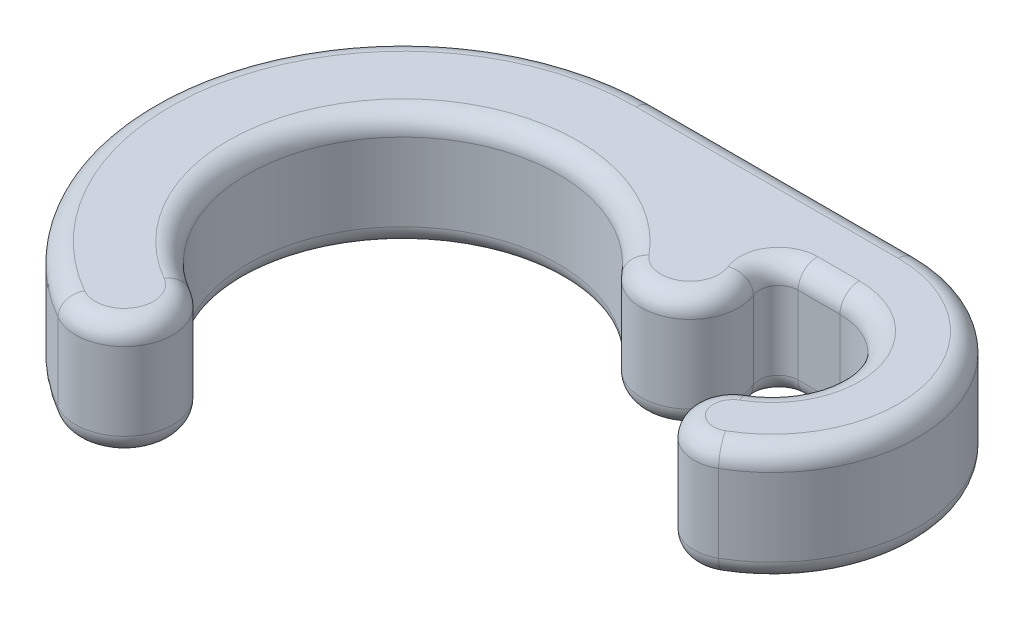
ISO-10303-21;
HEADER;
FILE_DESCRIPTION(('STEP AP214'),'2;1');
FILE_NAME('part.step','',(''),(''),'','','');
FILE_SCHEMA(('AUTOMOTIVE_DESIGN { 1 0 10303 214 1 1 1 1 }'));
ENDSEC;
DATA;
#1=APPLICATION_CONTEXT('core data for automotive mechanical design processes');
#2=APPLICATION_PROTOCOL_DEFINITION('international standard','automotive_design',2000,#1);
#3=PRODUCT_CONTEXT('',#1,'mechanical');
#4=PRODUCT('Part','Part','',(#3));
#5=PRODUCT_RELATED_PRODUCT_CATEGORY('part','',(#4));
#6=PRODUCT_DEFINITION_FORMATION('','',#4);
#7=PRODUCT_DEFINITION_CONTEXT('part definition',#1,'design');
#8=PRODUCT_DEFINITION('design','',#6,#7);
#9=PRODUCT_DEFINITION_SHAPE('','',#8);
#10=(LENGTH_UNIT() NAMED_UNIT(*) SI_UNIT(.MILLI.,.METRE.));
#11=(NAMED_UNIT(*) PLANE_ANGLE_UNIT() SI_UNIT($,.RADIAN.));
#12=(NAMED_UNIT(*) SI_UNIT($,.STERADIAN.) SOLID_ANGLE_UNIT());
#13=UNCERTAINTY_MEASURE_WITH_UNIT(LENGTH_MEASURE(1.E-05),#10,'distance_accuracy_value','');
#14=(GEOMETRIC_REPRESENTATION_CONTEXT(3) GLOBAL_UNCERTAINTY_ASSIGNED_CONTEXT((#13)) GLOBAL_UNIT_ASSIGNED_CONTEXT((#10,
#11,#12)) REPRESENTATION_CONTEXT('',''));
#15=CARTESIAN_POINT('',(0.,0.,0.));
#16=DIRECTION('',(0.,0.,1.));
#17=DIRECTION('',(1.,0.,0.));
#18=AXIS2_PLACEMENT_3D('',#15,#16,#17);
#19=CARTESIAN_POINT('',(4.05056924853039,3.,-3.33996837752395));
#20=DIRECTION('',(0.,-1.,0.));
#21=DIRECTION('',(0.,0.,-1.));
#22=AXIS2_PLACEMENT_3D('',#19,#20,#21);
#23=CYLINDRICAL_SURFACE('',#22,1.25);
#24=DIRECTION('',(0.,-1.,0.));
#25=VECTOR('',#24,1.);
#26=CARTESIAN_POINT('',(3.0861479988803,3.,-2.54473781144682));
#27=LINE('',#26,#25);
#28=CARTESIAN_POINT('',(3.0861479988803,2.5,-2.54473781144682));
#29=VERTEX_POINT('',#28);
#30=CARTESIAN_POINT('',(3.0861479988803,0.5,-2.54473781144682));
#31=VERTEX_POINT('',#30);
#32=EDGE_CURVE('E283',#29,#31,#27,.T.);
#33=ORIENTED_EDGE('',*,*,#32,.T.);
#34=CARTESIAN_POINT('',(4.05056924853039,0.5,-3.33996837752395));
#35=DIRECTION('',(0.,1.,0.));
#36=DIRECTION('',(0.,0.,1.));
#37=AXIS2_PLACEMENT_3D('',#34,#35,#36);
#38=CIRCLE('',#37,1.25);
#39=CARTESIAN_POINT('',(5.20825392268006,0.5,-3.81141953643541));
#40=VERTEX_POINT('',#39);
#41=EDGE_CURVE('E242',#31,#40,#38,.T.);
#42=ORIENTED_EDGE('',*,*,#41,.T.);
#43=DIRECTION('',(0.,-1.,0.));
#44=VECTOR('',#43,1.);
#45=CARTESIAN_POINT('',(5.20825392268006,3.,-3.81141953643541));
#46=LINE('',#45,#44);
#47=CARTESIAN_POINT('',(5.20825392268006,2.5,-3.81141953643541));
#48=VERTEX_POINT('',#47);
#49=EDGE_CURVE('E193',#40,#48,#46,.F.);
#50=ORIENTED_EDGE('',*,*,#49,.T.);
#51=CARTESIAN_POINT('',(4.05056924853039,2.5,-3.33996837752395));
#52=DIRECTION('',(0.,1.,0.));
#53=DIRECTION('',(0.,0.,1.));
#54=AXIS2_PLACEMENT_3D('',#51,#52,#53);
#55=CIRCLE('',#54,1.25);
#56=EDGE_CURVE('E240',#48,#29,#55,.F.);
#57=ORIENTED_EDGE('',*,*,#56,.T.);
#58=EDGE_LOOP('',(#33,#42,#50,#57));
#59=FACE_BOUND('',#58,.T.);
#60=ADVANCED_FACE('F36',(#59),#23,.T.);
#61=CARTESIAN_POINT('',(6.75,3.,-4.5));
#62=DIRECTION('',(0.,0.,-1.));
#63=DIRECTION('',(-1.,0.,0.));
#64=AXIS2_PLACEMENT_3D('',#61,#62,#63);
#65=PLANE('',#64);
#66=DIRECTION('',(0.,1.,0.));
#67=VECTOR('',#66,1.);
#68=CARTESIAN_POINT('',(5.67132779233993,0.,-4.5));
#69=LINE('',#68,#67);
#70=CARTESIAN_POINT('',(5.67132779233993,2.5,-4.5));
#71=VERTEX_POINT('',#70);
#72=CARTESIAN_POINT('',(5.67132779233993,0.5,-4.5));
#73=VERTEX_POINT('',#72);
#74=EDGE_CURVE('E337',#71,#73,#69,.F.);
#75=ORIENTED_EDGE('',*,*,#74,.T.);
#76=DIRECTION('',(1.,0.,0.));
#77=VECTOR('',#76,1.);
#78=CARTESIAN_POINT('',(6.75,0.5,-4.5));
#79=LINE('',#78,#77);
#80=CARTESIAN_POINT('',(6.75,0.5,-4.5));
#81=VERTEX_POINT('',#80);
#82=EDGE_CURVE('E209',#73,#81,#79,.T.);
#83=ORIENTED_EDGE('',*,*,#82,.T.);
#84=DIRECTION('',(0.,-1.,0.));
#85=VECTOR('',#84,1.);
#86=CARTESIAN_POINT('',(6.75,3.,-4.5));
#87=LINE('',#86,#85);
#88=CARTESIAN_POINT('',(6.75,2.5,-4.5));
#89=VERTEX_POINT('',#88);
#90=EDGE_CURVE('E335',#89,#81,#87,.T.);
#91=ORIENTED_EDGE('',*,*,#90,.F.);
#92=DIRECTION('',(1.,0.,0.));
#93=VECTOR('',#92,1.);
#94=CARTESIAN_POINT('',(5.67132779233993,2.5,-4.5));
#95=LINE('',#94,#93);
#96=EDGE_CURVE('E207',#89,#71,#95,.F.);
#97=ORIENTED_EDGE('',*,*,#96,.T.);
#98=EDGE_LOOP('',(#75,#83,#91,#97));
#99=FACE_BOUND('',#98,.T.);
#100=ADVANCED_FACE('F372',(#99),#65,.F.);
#101=CARTESIAN_POINT('',(6.75,3.,-2.75));
#102=DIRECTION('',(0.,-1.,0.));
#103=DIRECTION('',(0.,0.,-1.));
#104=AXIS2_PLACEMENT_3D('',#101,#102,#103);
#105=CYLINDRICAL_SURFACE('',#104,1.75);
#106=ORIENTED_EDGE('',*,*,#90,.T.);
#107=CARTESIAN_POINT('',(6.75,0.5,-2.75));
#108=DIRECTION('',(0.,1.,0.));
#109=DIRECTION('',(0.,0.,1.));
#110=AXIS2_PLACEMENT_3D('',#107,#108,#109);
#111=CIRCLE('',#110,1.75);
#112=CARTESIAN_POINT('',(7.625,0.5,-1.23445554337723));
#113=VERTEX_POINT('',#112);
#114=EDGE_CURVE('E213',#81,#113,#111,.F.);
#115=ORIENTED_EDGE('',*,*,#114,.T.);
#116=DIRECTION('',(0.,-1.,0.));
#117=VECTOR('',#116,1.);
#118=CARTESIAN_POINT('',(7.625,3.,-1.23445554337723));
#119=LINE('',#118,#117);
#120=CARTESIAN_POINT('',(7.625,2.5,-1.23445554337723));
#121=VERTEX_POINT('',#120);
#122=EDGE_CURVE('E326',#121,#113,#119,.T.);
#123=ORIENTED_EDGE('',*,*,#122,.F.);
#124=CARTESIAN_POINT('',(6.75,2.5,-2.75));
#125=DIRECTION('',(0.,1.,0.));
#126=DIRECTION('',(0.,0.,1.));
#127=AXIS2_PLACEMENT_3D('',#124,#125,#126);
#128=CIRCLE('',#127,1.75);
#129=EDGE_CURVE('E211',#121,#89,#128,.T.);
#130=ORIENTED_EDGE('',*,*,#129,.T.);
#131=EDGE_LOOP('',(#106,#115,#123,#130));
#132=FACE_BOUND('',#131,.T.);
#133=ADVANCED_FACE('F332',(#132),#105,.F.);
#134=CARTESIAN_POINT('',(8.12499999999999,3.,-0.368430139592791));
#135=DIRECTION('',(0.,-1.,0.));
#136=DIRECTION('',(0.,0.,-1.));
#137=AXIS2_PLACEMENT_3D('',#134,#135,#136);
#138=CYLINDRICAL_SURFACE('',#137,1.);
#139=ORIENTED_EDGE('',*,*,#122,.T.);
#140=CARTESIAN_POINT('',(8.12499999999999,0.5,-0.368430139592791));
#141=DIRECTION('',(0.,1.,0.));
#142=DIRECTION('',(0.,0.,1.));
#143=AXIS2_PLACEMENT_3D('',#140,#141,#142);
#144=CIRCLE('',#143,1.);
#145=CARTESIAN_POINT('',(8.62499999999999,0.5,0.497595264191649));
#146=VERTEX_POINT('',#145);
#147=EDGE_CURVE('E217',#113,#146,#144,.T.);
#148=ORIENTED_EDGE('',*,*,#147,.T.);
#149=DIRECTION('',(0.,-1.,0.));
#150=VECTOR('',#149,1.);
#151=CARTESIAN_POINT('',(8.62499999999999,3.,0.497595264191649));
#152=LINE('',#151,#150);
#153=CARTESIAN_POINT('',(8.62499999999999,2.5,0.497595264191649));
#154=VERTEX_POINT('',#153);
#155=EDGE_CURVE('E329',#154,#146,#152,.T.);
#156=ORIENTED_EDGE('',*,*,#155,.F.);
#157=CARTESIAN_POINT('',(8.12499999999999,2.5,-0.368430139592791));
#158=DIRECTION('',(0.,1.,0.));
#159=DIRECTION('',(0.,0.,1.));
#160=AXIS2_PLACEMENT_3D('',#157,#158,#159);
#161=CIRCLE('',#160,1.);
#162=EDGE_CURVE('E215',#154,#121,#161,.F.);
#163=ORIENTED_EDGE('',*,*,#162,.T.);
#164=EDGE_LOOP('',(#139,#148,#156,#163));
#165=FACE_BOUND('',#164,.T.);
#166=ADVANCED_FACE('F325',(#165),#138,.T.);
#167=CARTESIAN_POINT('',(6.75,3.,-2.75));
#168=DIRECTION('',(0.,-1.,0.));
#169=DIRECTION('',(0.,0.,-1.));
#170=AXIS2_PLACEMENT_3D('',#167,#168,#169);
#171=CYLINDRICAL_SURFACE('',#170,3.75);
#172=ORIENTED_EDGE('',*,*,#155,.T.);
#173=CARTESIAN_POINT('',(6.75,0.5,-2.75));
#174=DIRECTION('',(0.,1.,0.));
#175=DIRECTION('',(0.,0.,1.));
#176=AXIS2_PLACEMENT_3D('',#173,#174,#175);
#177=CIRCLE('',#176,3.75);
#178=CARTESIAN_POINT('',(6.75,0.5,-6.5));
#179=VERTEX_POINT('',#178);
#180=EDGE_CURVE('E221',#146,#179,#177,.T.);
#181=ORIENTED_EDGE('',*,*,#180,.T.);
#182=DIRECTION('',(0.,-1.,0.));
#183=VECTOR('',#182,1.);
#184=CARTESIAN_POINT('',(6.75,3.,-6.5));
#185=LINE('',#184,#183);
#186=CARTESIAN_POINT('',(6.75,2.5,-6.5));
#187=VERTEX_POINT('',#186);
#188=EDGE_CURVE('E339',#187,#179,#185,.T.);
#189=ORIENTED_EDGE('',*,*,#188,.F.);
#190=CARTESIAN_POINT('',(6.75,2.5,-2.75));
#191=DIRECTION('',(0.,1.,0.));
#192=DIRECTION('',(0.,0.,1.));
#193=AXIS2_PLACEMENT_3D('',#190,#191,#192);
#194=CIRCLE('',#193,3.75);
#195=EDGE_CURVE('E219',#187,#154,#194,.F.);
#196=ORIENTED_EDGE('',*,*,#195,.T.);
#197=EDGE_LOOP('',(#172,#181,#189,#196));
#198=FACE_BOUND('',#197,.T.);
#199=ADVANCED_FACE('F418',(#198),#171,.T.);
#200=CARTESIAN_POINT('',(6.75,3.,-6.5));
#201=DIRECTION('',(0.,0.,1.));
#202=DIRECTION('',(1.,0.,0.));
#203=AXIS2_PLACEMENT_3D('',#200,#201,#202);
#204=PLANE('',#203);
#205=ORIENTED_EDGE('',*,*,#188,.T.);
#206=DIRECTION('',(-1.,0.,0.));
#207=VECTOR('',#206,1.);
#208=CARTESIAN_POINT('',(6.75,0.5,-6.5));
#209=LINE('',#208,#207);
#210=CARTESIAN_POINT('',(0.,0.5,-6.5));
#211=VERTEX_POINT('',#210);
#212=EDGE_CURVE('E225',#179,#211,#209,.T.);
#213=ORIENTED_EDGE('',*,*,#212,.T.);
#214=DIRECTION('',(0.,-1.,0.));
#215=VECTOR('',#214,1.);
#216=CARTESIAN_POINT('',(0.,3.,-6.5));
#217=LINE('',#216,#215);
#218=CARTESIAN_POINT('',(0.,2.5,-6.5));
#219=VERTEX_POINT('',#218);
#220=EDGE_CURVE('E422',#219,#211,#217,.T.);
#221=ORIENTED_EDGE('',*,*,#220,.F.);
#222=DIRECTION('',(-1.,0.,0.));
#223=VECTOR('',#222,1.);
#224=CARTESIAN_POINT('',(6.75,2.5,-6.5));
#225=LINE('',#224,#223);
#226=EDGE_CURVE('E223',#219,#187,#225,.F.);
#227=ORIENTED_EDGE('',*,*,#226,.T.);
#228=EDGE_LOOP('',(#205,#213,#221,#227));
#229=FACE_BOUND('',#228,.T.);
#230=ADVANCED_FACE('F667',(#229),#204,.F.);
#231=CARTESIAN_POINT('',(0.,3.,0.));
#232=DIRECTION('',(0.,-1.,0.));
#233=DIRECTION('',(0.,0.,-1.));
#234=AXIS2_PLACEMENT_3D('',#231,#232,#233);
#235=CYLINDRICAL_SURFACE('',#234,6.5);
#236=ORIENTED_EDGE('',*,*,#220,.T.);
#237=CARTESIAN_POINT('',(0.,0.5,0.));
#238=DIRECTION('',(0.,1.,0.));
#239=DIRECTION('',(0.,0.,1.));
#240=AXIS2_PLACEMENT_3D('',#237,#238,#239);
#241=CIRCLE('',#240,6.5);
#242=CARTESIAN_POINT('',(-3.25000000000003,0.5,5.62916512459883));
#243=VERTEX_POINT('',#242);
#244=EDGE_CURVE('E229',#211,#243,#241,.T.);
#245=ORIENTED_EDGE('',*,*,#244,.T.);
#246=DIRECTION('',(0.,-1.,0.));
#247=VECTOR('',#246,1.);
#248=CARTESIAN_POINT('',(-3.25000000000003,3.,5.62916512459883));
#249=LINE('',#248,#247);
#250=CARTESIAN_POINT('',(-3.25000000000003,2.5,5.62916512459883));
#251=VERTEX_POINT('',#250);
#252=EDGE_CURVE('E424',#251,#243,#249,.T.);
#253=ORIENTED_EDGE('',*,*,#252,.F.);
#254=CARTESIAN_POINT('',(0.,2.5,0.));
#255=DIRECTION('',(0.,1.,0.));
#256=DIRECTION('',(0.,0.,1.));
#257=AXIS2_PLACEMENT_3D('',#254,#255,#256);
#258=CIRCLE('',#257,6.5);
#259=EDGE_CURVE('E227',#251,#219,#258,.F.);
#260=ORIENTED_EDGE('',*,*,#259,.T.);
#261=EDGE_LOOP('',(#236,#245,#253,#260));
#262=FACE_BOUND('',#261,.T.);
#263=ADVANCED_FACE('F438',(#262),#235,.T.);
#264=CARTESIAN_POINT('',(-2.62500000000002,3.,4.54663336986829));
#265=DIRECTION('',(0.,-1.,0.));
#266=DIRECTION('',(0.,0.,-1.));
#267=AXIS2_PLACEMENT_3D('',#264,#265,#266);
#268=CYLINDRICAL_SURFACE('',#267,1.25);
#269=ORIENTED_EDGE('',*,*,#252,.T.);
#270=CARTESIAN_POINT('',(-2.62500000000002,0.5,4.54663336986829));
#271=DIRECTION('',(0.,1.,0.));
#272=DIRECTION('',(0.,0.,1.));
#273=AXIS2_PLACEMENT_3D('',#270,#271,#272);
#274=CIRCLE('',#273,1.25);
#275=CARTESIAN_POINT('',(-2.00000000000001,0.5,3.46410161513774));
#276=VERTEX_POINT('',#275);
#277=EDGE_CURVE('E233',#243,#276,#274,.T.);
#278=ORIENTED_EDGE('',*,*,#277,.T.);
#279=DIRECTION('',(0.,-1.,0.));
#280=VECTOR('',#279,1.);
#281=CARTESIAN_POINT('',(-2.00000000000001,3.,3.46410161513774));
#282=LINE('',#281,#280);
#283=CARTESIAN_POINT('',(-2.00000000000001,2.5,3.46410161513774));
#284=VERTEX_POINT('',#283);
#285=EDGE_CURVE('E389',#284,#276,#282,.T.);
#286=ORIENTED_EDGE('',*,*,#285,.F.);
#287=CARTESIAN_POINT('',(-2.62500000000002,2.5,4.54663336986829));
#288=DIRECTION('',(0.,1.,0.));
#289=DIRECTION('',(0.,0.,1.));
#290=AXIS2_PLACEMENT_3D('',#287,#288,#289);
#291=CIRCLE('',#290,1.25);
#292=EDGE_CURVE('E231',#284,#251,#291,.F.);
#293=ORIENTED_EDGE('',*,*,#292,.T.);
#294=EDGE_LOOP('',(#269,#278,#286,#293));
#295=FACE_BOUND('',#294,.T.);
#296=ADVANCED_FACE('F433',(#295),#268,.T.);
#297=CARTESIAN_POINT('',(0.,3.,0.));
#298=DIRECTION('',(0.,-1.,0.));
#299=DIRECTION('',(0.,0.,-1.));
#300=AXIS2_PLACEMENT_3D('',#297,#298,#299);
#301=CYLINDRICAL_SURFACE('',#300,4.);
#302=ORIENTED_EDGE('',*,*,#285,.T.);
#303=CARTESIAN_POINT('',(0.,0.5,0.));
#304=DIRECTION('',(0.,1.,0.));
#305=DIRECTION('',(0.,0.,1.));
#306=AXIS2_PLACEMENT_3D('',#303,#304,#305);
#307=CIRCLE('',#306,4.);
#308=EDGE_CURVE('E238',#276,#31,#307,.F.);
#309=ORIENTED_EDGE('',*,*,#308,.T.);
#310=ORIENTED_EDGE('',*,*,#32,.F.);
#311=CARTESIAN_POINT('',(0.,2.5,0.));
#312=DIRECTION('',(0.,1.,0.));
#313=DIRECTION('',(0.,0.,1.));
#314=AXIS2_PLACEMENT_3D('',#311,#312,#313);
#315=CIRCLE('',#314,4.);
#316=EDGE_CURVE('E235',#29,#284,#315,.T.);
#317=ORIENTED_EDGE('',*,*,#316,.T.);
#318=EDGE_LOOP('',(#302,#309,#310,#317));
#319=FACE_BOUND('',#318,.T.);
#320=ADVANCED_FACE('F431',(#319),#301,.F.);
#321=CARTESIAN_POINT('',(4.05056924853039,3.,-3.33996837752395));
#322=DIRECTION('',(0.,1.,0.));
#323=DIRECTION('',(0.,0.,1.));
#324=AXIS2_PLACEMENT_3D('',#321,#322,#323);
#325=PLANE('',#324);
#326=CARTESIAN_POINT('',(-2.62500000000002,3.,4.54663336986829));
#327=DIRECTION('',(0.,1.,0.));
#328=DIRECTION('',(0.,0.,1.));
#329=AXIS2_PLACEMENT_3D('',#326,#327,#328);
#330=CIRCLE('',#329,0.75);
#331=CARTESIAN_POINT('',(-3.00000000000003,3.,5.19615242270662));
#332=VERTEX_POINT('',#331);
#333=CARTESIAN_POINT('',(-2.25000000000002,3.,3.89711431702996));
#334=VERTEX_POINT('',#333);
#335=EDGE_CURVE('E45',#332,#334,#330,.T.);
#336=ORIENTED_EDGE('',*,*,#335,.T.);
#337=CARTESIAN_POINT('',(0.,3.,0.));
#338=DIRECTION('',(0.,1.,0.));
#339=DIRECTION('',(0.,0.,1.));
#340=AXIS2_PLACEMENT_3D('',#337,#338,#339);
#341=CIRCLE('',#340,4.5);
#342=CARTESIAN_POINT('',(3.47191649874034,3.,-2.86283003787767));
#343=VERTEX_POINT('',#342);
#344=EDGE_CURVE('E11',#334,#343,#341,.F.);
#345=ORIENTED_EDGE('',*,*,#344,.T.);
#346=CARTESIAN_POINT('',(4.05056924853039,3.,-3.33996837752395));
#347=DIRECTION('',(0.,1.,0.));
#348=DIRECTION('',(0.,0.,1.));
#349=AXIS2_PLACEMENT_3D('',#346,#347,#348);
#350=CIRCLE('',#349,0.75);
#351=CARTESIAN_POINT('',(4.74518005302019,3.,-3.62283907287083));
#352=VERTEX_POINT('',#351);
#353=EDGE_CURVE('E244',#343,#352,#350,.T.);
#354=ORIENTED_EDGE('',*,*,#353,.T.);
#355=CARTESIAN_POINT('',(5.67132779233993,3.,-4.));
#356=DIRECTION('',(0.,1.,0.));
#357=DIRECTION('',(0.,0.,1.));
#358=AXIS2_PLACEMENT_3D('',#355,#356,#357);
#359=CIRCLE('',#358,1.);
#360=CARTESIAN_POINT('',(5.67132779233993,3.,-5.));
#361=VERTEX_POINT('',#360);
#362=EDGE_CURVE('E246',#352,#361,#359,.F.);
#363=ORIENTED_EDGE('',*,*,#362,.T.);
#364=DIRECTION('',(1.,0.,0.));
#365=VECTOR('',#364,1.);
#366=CARTESIAN_POINT('',(6.75,3.,-5.));
#367=LINE('',#366,#365);
#368=CARTESIAN_POINT('',(6.75,3.,-5.));
#369=VERTEX_POINT('',#368);
#370=EDGE_CURVE('E248',#361,#369,#367,.T.);
#371=ORIENTED_EDGE('',*,*,#370,.T.);
#372=CARTESIAN_POINT('',(6.75,3.,-2.75));
#373=DIRECTION('',(0.,1.,0.));
#374=DIRECTION('',(0.,0.,1.));
#375=AXIS2_PLACEMENT_3D('',#372,#373,#374);
#376=CIRCLE('',#375,2.25);
#377=CARTESIAN_POINT('',(7.87499999999999,3.,-0.801442841485011));
#378=VERTEX_POINT('',#377);
#379=EDGE_CURVE('E250',#369,#378,#376,.F.);
#380=ORIENTED_EDGE('',*,*,#379,.T.);
#381=CARTESIAN_POINT('',(8.12499999999999,3.,-0.368430139592791));
#382=DIRECTION('',(0.,1.,0.));
#383=DIRECTION('',(0.,0.,1.));
#384=AXIS2_PLACEMENT_3D('',#381,#382,#383);
#385=CIRCLE('',#384,0.5);
#386=CARTESIAN_POINT('',(8.37499999999999,3.,0.0645825622994286));
#387=VERTEX_POINT('',#386);
#388=EDGE_CURVE('E252',#378,#387,#385,.T.);
#389=ORIENTED_EDGE('',*,*,#388,.T.);
#390=CARTESIAN_POINT('',(6.75,3.,-2.75));
#391=DIRECTION('',(0.,1.,0.));
#392=DIRECTION('',(0.,0.,1.));
#393=AXIS2_PLACEMENT_3D('',#390,#391,#392);
#394=CIRCLE('',#393,3.25);
#395=CARTESIAN_POINT('',(6.75,3.,-6.));
#396=VERTEX_POINT('',#395);
#397=EDGE_CURVE('E254',#387,#396,#394,.T.);
#398=ORIENTED_EDGE('',*,*,#397,.T.);
#399=DIRECTION('',(-1.,0.,0.));
#400=VECTOR('',#399,1.);
#401=CARTESIAN_POINT('',(0.,3.,-6.));
#402=LINE('',#401,#400);
#403=CARTESIAN_POINT('',(0.,3.,-6.));
#404=VERTEX_POINT('',#403);
#405=EDGE_CURVE('E256',#396,#404,#402,.T.);
#406=ORIENTED_EDGE('',*,*,#405,.T.);
#407=CARTESIAN_POINT('',(0.,3.,0.));
#408=DIRECTION('',(0.,1.,0.));
#409=DIRECTION('',(0.,0.,1.));
#410=AXIS2_PLACEMENT_3D('',#407,#408,#409);
#411=CIRCLE('',#410,6.);
#412=EDGE_CURVE('E56',#404,#332,#411,.T.);
#413=ORIENTED_EDGE('',*,*,#412,.T.);
#414=EDGE_LOOP('',(#336,#345,#354,#363,#371,#380,#389,#398,#406,#413));
#415=FACE_BOUND('',#414,.T.);
#416=ADVANCED_FACE('F450',(#415),#325,.T.);
#417=CARTESIAN_POINT('',(4.05056924853039,0.,-3.33996837752395));
#418=DIRECTION('',(0.,1.,0.));
#419=DIRECTION('',(0.,0.,1.));
#420=AXIS2_PLACEMENT_3D('',#417,#418,#419);
#421=PLANE('',#420);
#422=DIRECTION('',(1.,0.,0.));
#423=VECTOR('',#422,1.);
#424=CARTESIAN_POINT('',(4.05056924853039,0.,-5.));
#425=LINE('',#424,#423);
#426=CARTESIAN_POINT('',(6.75,0.,-5.));
#427=VERTEX_POINT('',#426);
#428=CARTESIAN_POINT('',(5.67132779233993,0.,-5.));
#429=VERTEX_POINT('',#428);
#430=EDGE_CURVE('E197',#427,#429,#425,.F.);
#431=ORIENTED_EDGE('',*,*,#430,.T.);
#432=CARTESIAN_POINT('',(5.67132779233993,0.,-4.));
#433=DIRECTION('',(0.,1.,0.));
#434=DIRECTION('',(0.,0.,1.));
#435=AXIS2_PLACEMENT_3D('',#432,#433,#434);
#436=CIRCLE('',#435,1.);
#437=CARTESIAN_POINT('',(4.74518005302019,0.,-3.62283907287083));
#438=VERTEX_POINT('',#437);
#439=EDGE_CURVE('E178',#429,#438,#436,.T.);
#440=ORIENTED_EDGE('',*,*,#439,.T.);
#441=CARTESIAN_POINT('',(4.05056924853039,0.,-3.33996837752395));
#442=DIRECTION('',(0.,1.,0.));
#443=DIRECTION('',(0.,0.,1.));
#444=AXIS2_PLACEMENT_3D('',#441,#442,#443);
#445=CIRCLE('',#444,0.75);
#446=CARTESIAN_POINT('',(3.47191649874034,0.,-2.86283003787767));
#447=VERTEX_POINT('',#446);
#448=EDGE_CURVE('E186',#438,#447,#445,.F.);
#449=ORIENTED_EDGE('',*,*,#448,.T.);
#450=CARTESIAN_POINT('',(0.,0.,0.));
#451=DIRECTION('',(0.,1.,0.));
#452=DIRECTION('',(0.,0.,1.));
#453=AXIS2_PLACEMENT_3D('',#450,#451,#452);
#454=CIRCLE('',#453,4.5);
#455=CARTESIAN_POINT('',(-2.25000000000002,0.,3.89711431702996));
#456=VERTEX_POINT('',#455);
#457=EDGE_CURVE('E192',#447,#456,#454,.T.);
#458=ORIENTED_EDGE('',*,*,#457,.T.);
#459=CARTESIAN_POINT('',(-2.62500000000002,0.,4.54663336986829));
#460=DIRECTION('',(0.,1.,0.));
#461=DIRECTION('',(0.,0.,1.));
#462=AXIS2_PLACEMENT_3D('',#459,#460,#461);
#463=CIRCLE('',#462,0.75);
#464=CARTESIAN_POINT('',(-3.00000000000003,0.,5.19615242270662));
#465=VERTEX_POINT('',#464);
#466=EDGE_CURVE('E348',#456,#465,#463,.F.);
#467=ORIENTED_EDGE('',*,*,#466,.T.);
#468=CARTESIAN_POINT('',(0.,0.,0.));
#469=DIRECTION('',(0.,1.,0.));
#470=DIRECTION('',(0.,0.,1.));
#471=AXIS2_PLACEMENT_3D('',#468,#469,#470);
#472=CIRCLE('',#471,6.);
#473=CARTESIAN_POINT('',(0.,0.,-6.));
#474=VERTEX_POINT('',#473);
#475=EDGE_CURVE('E350',#465,#474,#472,.F.);
#476=ORIENTED_EDGE('',*,*,#475,.T.);
#477=DIRECTION('',(-1.,0.,0.));
#478=VECTOR('',#477,1.);
#479=CARTESIAN_POINT('',(4.05056924853039,0.,-6.));
#480=LINE('',#479,#478);
#481=CARTESIAN_POINT('',(6.75,0.,-6.));
#482=VERTEX_POINT('',#481);
#483=EDGE_CURVE('E352',#474,#482,#480,.F.);
#484=ORIENTED_EDGE('',*,*,#483,.T.);
#485=CARTESIAN_POINT('',(6.75,0.,-2.75));
#486=DIRECTION('',(0.,1.,0.));
#487=DIRECTION('',(0.,0.,1.));
#488=AXIS2_PLACEMENT_3D('',#485,#486,#487);
#489=CIRCLE('',#488,3.25);
#490=CARTESIAN_POINT('',(8.37499999999999,0.,0.0645825622994293));
#491=VERTEX_POINT('',#490);
#492=EDGE_CURVE('E354',#482,#491,#489,.F.);
#493=ORIENTED_EDGE('',*,*,#492,.T.);
#494=CARTESIAN_POINT('',(8.12499999999999,0.,-0.368430139592791));
#495=DIRECTION('',(0.,1.,0.));
#496=DIRECTION('',(0.,0.,1.));
#497=AXIS2_PLACEMENT_3D('',#494,#495,#496);
#498=CIRCLE('',#497,0.5);
#499=CARTESIAN_POINT('',(7.87499999999999,0.,-0.801442841485011));
#500=VERTEX_POINT('',#499);
#501=EDGE_CURVE('E356',#491,#500,#498,.F.);
#502=ORIENTED_EDGE('',*,*,#501,.T.);
#503=CARTESIAN_POINT('',(6.75,0.,-2.75));
#504=DIRECTION('',(0.,1.,0.));
#505=DIRECTION('',(0.,0.,1.));
#506=AXIS2_PLACEMENT_3D('',#503,#504,#505);
#507=CIRCLE('',#506,2.25);
#508=EDGE_CURVE('E202',#500,#427,#507,.T.);
#509=ORIENTED_EDGE('',*,*,#508,.T.);
#510=EDGE_LOOP('',(#431,#440,#449,#458,#467,#476,#484,#493,#502,#509));
#511=FACE_BOUND('',#510,.T.);
#512=ADVANCED_FACE('F195',(#511),#421,.F.);
#513=CARTESIAN_POINT('',(5.67132779233993,3.,-4.));
#514=DIRECTION('',(0.,-1.,0.));
#515=DIRECTION('',(0.,0.,-1.));
#516=AXIS2_PLACEMENT_3D('',#513,#514,#515);
#517=CYLINDRICAL_SURFACE('',#516,0.5);
#518=ORIENTED_EDGE('',*,*,#49,.F.);
#519=CARTESIAN_POINT('',(5.67132779233993,0.5,-4.));
#520=DIRECTION('',(0.,1.,0.));
#521=DIRECTION('',(0.,0.,1.));
#522=AXIS2_PLACEMENT_3D('',#519,#520,#521);
#523=CIRCLE('',#522,0.5);
#524=EDGE_CURVE('E180',#40,#73,#523,.F.);
#525=ORIENTED_EDGE('',*,*,#524,.T.);
#526=ORIENTED_EDGE('',*,*,#74,.F.);
#527=CARTESIAN_POINT('',(5.67132779233993,2.5,-4.));
#528=DIRECTION('',(0.,1.,0.));
#529=DIRECTION('',(0.,0.,1.));
#530=AXIS2_PLACEMENT_3D('',#527,#528,#529);
#531=CIRCLE('',#530,0.5);
#532=EDGE_CURVE('E199',#71,#48,#531,.T.);
#533=ORIENTED_EDGE('',*,*,#532,.T.);
#534=EDGE_LOOP('',(#518,#525,#526,#533));
#535=FACE_BOUND('',#534,.T.);
#536=ADVANCED_FACE('F370',(#535),#517,.F.);
#537=CARTESIAN_POINT('',(6.75,0.5,-6.));
#538=DIRECTION('',(-1.,0.,0.));
#539=DIRECTION('',(0.,0.,1.));
#540=AXIS2_PLACEMENT_3D('',#537,#538,#539);
#541=CYLINDRICAL_SURFACE('',#540,0.5);
#542=CARTESIAN_POINT('',(0.,0.5,-6.));
#543=DIRECTION('',(-1.,0.,0.));
#544=DIRECTION('',(0.,0.,1.));
#545=AXIS2_PLACEMENT_3D('',#542,#543,#544);
#546=CIRCLE('',#545,0.5);
#547=EDGE_CURVE('E277',#211,#474,#546,.T.);
#548=ORIENTED_EDGE('',*,*,#547,.F.);
#549=ORIENTED_EDGE('',*,*,#212,.F.);
#550=CARTESIAN_POINT('',(6.75,0.5,-6.));
#551=DIRECTION('',(1.,0.,0.));
#552=DIRECTION('',(0.,0.,-1.));
#553=AXIS2_PLACEMENT_3D('',#550,#551,#552);
#554=CIRCLE('',#553,0.5);
#555=EDGE_CURVE('E280',#482,#179,#554,.T.);
#556=ORIENTED_EDGE('',*,*,#555,.F.);
#557=ORIENTED_EDGE('',*,*,#483,.F.);
#558=EDGE_LOOP('',(#548,#549,#556,#557));
#559=FACE_BOUND('',#558,.T.);
#560=ADVANCED_FACE('F408',(#559),#541,.T.);
#561=CARTESIAN_POINT('',(6.75,0.5,-2.75));
#562=DIRECTION('',(0.,1.,0.));
#563=DIRECTION('',(0.,0.,1.));
#564=AXIS2_PLACEMENT_3D('',#561,#562,#563);
#565=TOROIDAL_SURFACE('',#564,3.25,0.5);
#566=ORIENTED_EDGE('',*,*,#555,.T.);
#567=ORIENTED_EDGE('',*,*,#180,.F.);
#568=CARTESIAN_POINT('',(8.37499999999999,0.5,0.0645825622994293));
#569=DIRECTION('',(-0.86602540378444,0.,0.499999999999997));
#570=DIRECTION('',(0.499999999999997,0.,0.86602540378444));
#571=AXIS2_PLACEMENT_3D('',#568,#569,#570);
#572=CIRCLE('',#571,0.5);
#573=EDGE_CURVE('E274',#491,#146,#572,.T.);
#574=ORIENTED_EDGE('',*,*,#573,.F.);
#575=ORIENTED_EDGE('',*,*,#492,.F.);
#576=EDGE_LOOP('',(#566,#567,#574,#575));
#577=FACE_BOUND('',#576,.T.);
#578=ADVANCED_FACE('F414',(#577),#565,.T.);
#579=CARTESIAN_POINT('',(0.,0.5,0.));
#580=DIRECTION('',(0.,1.,0.));
#581=DIRECTION('',(0.,0.,1.));
#582=AXIS2_PLACEMENT_3D('',#579,#580,#581);
#583=TOROIDAL_SURFACE('',#582,6.,0.5);
#584=ORIENTED_EDGE('',*,*,#547,.T.);
#585=ORIENTED_EDGE('',*,*,#475,.F.);
#586=CARTESIAN_POINT('',(-3.00000000000003,0.5,5.19615242270662));
#587=DIRECTION('',(0.866025403784436,0.,0.500000000000004));
#588=DIRECTION('',(0.500000000000004,0.,-0.866025403784436));
#589=AXIS2_PLACEMENT_3D('',#586,#587,#588);
#590=CIRCLE('',#589,0.5);
#591=EDGE_CURVE('E271',#243,#465,#590,.T.);
#592=ORIENTED_EDGE('',*,*,#591,.F.);
#593=ORIENTED_EDGE('',*,*,#244,.F.);
#594=EDGE_LOOP('',(#584,#585,#592,#593));
#595=FACE_BOUND('',#594,.T.);
#596=ADVANCED_FACE('F403',(#595),#583,.T.);
#597=CARTESIAN_POINT('',(8.12499999999999,0.5,-0.368430139592791));
#598=DIRECTION('',(0.,1.,0.));
#599=DIRECTION('',(0.,0.,1.));
#600=AXIS2_PLACEMENT_3D('',#597,#598,#599);
#601=DEGENERATE_TOROIDAL_SURFACE('',#600,0.5,0.5,.T.);
#602=ORIENTED_EDGE('',*,*,#573,.T.);
#603=ORIENTED_EDGE('',*,*,#147,.F.);
#604=CARTESIAN_POINT('',(7.87499999999999,0.5,-0.801442841485011));
#605=DIRECTION('',(0.86602540378444,0.,-0.499999999999997));
#606=DIRECTION('',(-0.499999999999997,0.,-0.866025403784441));
#607=AXIS2_PLACEMENT_3D('',#604,#605,#606);
#608=CIRCLE('',#607,0.5);
#609=EDGE_CURVE('E268',#500,#113,#608,.T.);
#610=ORIENTED_EDGE('',*,*,#609,.F.);
#611=ORIENTED_EDGE('',*,*,#501,.F.);
#612=EDGE_LOOP('',(#602,#603,#610,#611));
#613=FACE_BOUND('',#612,.T.);
#614=ADVANCED_FACE('F416',(#613),#601,.T.);
#615=CARTESIAN_POINT('',(-2.62500000000002,0.5,4.54663336986829));
#616=DIRECTION('',(0.,1.,0.));
#617=DIRECTION('',(0.,0.,1.));
#618=AXIS2_PLACEMENT_3D('',#615,#616,#617);
#619=TOROIDAL_SURFACE('',#618,0.75,0.5);
#620=ORIENTED_EDGE('',*,*,#591,.T.);
#621=ORIENTED_EDGE('',*,*,#466,.F.);
#622=CARTESIAN_POINT('',(-2.25000000000002,0.5,3.89711431702996));
#623=DIRECTION('',(-0.866025403784436,0.,-0.500000000000004));
#624=DIRECTION('',(-0.500000000000004,0.,0.866025403784436));
#625=AXIS2_PLACEMENT_3D('',#622,#623,#624);
#626=CIRCLE('',#625,0.5);
#627=EDGE_CURVE('E265',#276,#456,#626,.T.);
#628=ORIENTED_EDGE('',*,*,#627,.F.);
#629=ORIENTED_EDGE('',*,*,#277,.F.);
#630=EDGE_LOOP('',(#620,#621,#628,#629));
#631=FACE_BOUND('',#630,.T.);
#632=ADVANCED_FACE('F398',(#631),#619,.T.);
#633=CARTESIAN_POINT('',(6.75,0.5,-2.75));
#634=DIRECTION('',(0.,1.,0.));
#635=DIRECTION('',(0.,0.,1.));
#636=AXIS2_PLACEMENT_3D('',#633,#634,#635);
#637=TOROIDAL_SURFACE('',#636,2.25,0.5);
#638=ORIENTED_EDGE('',*,*,#609,.T.);
#639=ORIENTED_EDGE('',*,*,#114,.F.);
#640=CARTESIAN_POINT('',(6.75,0.5,-5.));
#641=DIRECTION('',(-1.,0.,0.));
#642=DIRECTION('',(0.,0.,1.));
#643=AXIS2_PLACEMENT_3D('',#640,#641,#642);
#644=CIRCLE('',#643,0.5);
#645=EDGE_CURVE('E262',#427,#81,#644,.T.);
#646=ORIENTED_EDGE('',*,*,#645,.F.);
#647=ORIENTED_EDGE('',*,*,#508,.F.);
#648=EDGE_LOOP('',(#638,#639,#646,#647));
#649=FACE_BOUND('',#648,.T.);
#650=ADVANCED_FACE('F362',(#649),#637,.T.);
#651=CARTESIAN_POINT('',(0.,0.5,0.));
#652=DIRECTION('',(0.,1.,0.));
#653=DIRECTION('',(0.,0.,1.));
#654=AXIS2_PLACEMENT_3D('',#651,#652,#653);
#655=TOROIDAL_SURFACE('',#654,4.5,0.5);
#656=ORIENTED_EDGE('',*,*,#627,.T.);
#657=ORIENTED_EDGE('',*,*,#457,.F.);
#658=CARTESIAN_POINT('',(3.47191649874034,0.5,-2.86283003787767));
#659=DIRECTION('',(0.636184452861704,0.,0.771536999720075));
#660=DIRECTION('',(0.771536999720075,0.,-0.636184452861704));
#661=AXIS2_PLACEMENT_3D('',#658,#659,#660);
#662=CIRCLE('',#661,0.5);
#663=EDGE_CURVE('E189',#31,#447,#662,.T.);
#664=ORIENTED_EDGE('',*,*,#663,.F.);
#665=ORIENTED_EDGE('',*,*,#308,.F.);
#666=EDGE_LOOP('',(#656,#657,#664,#665));
#667=FACE_BOUND('',#666,.T.);
#668=ADVANCED_FACE('F393',(#667),#655,.T.);
#669=CARTESIAN_POINT('',(6.75,0.5,-5.));
#670=DIRECTION('',(1.,0.,0.));
#671=DIRECTION('',(0.,0.,-1.));
#672=AXIS2_PLACEMENT_3D('',#669,#670,#671);
#673=CYLINDRICAL_SURFACE('',#672,0.5);
#674=ORIENTED_EDGE('',*,*,#645,.T.);
#675=ORIENTED_EDGE('',*,*,#82,.F.);
#676=CARTESIAN_POINT('',(5.67132779233993,0.5,-5.));
#677=DIRECTION('',(-1.,0.,0.));
#678=DIRECTION('',(0.,0.,1.));
#679=AXIS2_PLACEMENT_3D('',#676,#677,#678);
#680=CIRCLE('',#679,0.5);
#681=EDGE_CURVE('E183',#429,#73,#680,.T.);
#682=ORIENTED_EDGE('',*,*,#681,.F.);
#683=ORIENTED_EDGE('',*,*,#430,.F.);
#684=EDGE_LOOP('',(#674,#675,#682,#683));
#685=FACE_BOUND('',#684,.T.);
#686=ADVANCED_FACE('F365',(#685),#673,.T.);
#687=CARTESIAN_POINT('',(4.05056924853039,0.5,-3.33996837752395));
#688=DIRECTION('',(0.,1.,0.));
#689=DIRECTION('',(0.,0.,1.));
#690=AXIS2_PLACEMENT_3D('',#687,#688,#689);
#691=TOROIDAL_SURFACE('',#690,0.75,0.5);
#692=ORIENTED_EDGE('',*,*,#663,.T.);
#693=ORIENTED_EDGE('',*,*,#448,.F.);
#694=CARTESIAN_POINT('',(4.7451800530202,0.5,-3.62283907287083));
#695=DIRECTION('',(-0.377160927129174,0.,-0.926147739319738));
#696=DIRECTION('',(-0.926147739319738,0.,0.377160927129175));
#697=AXIS2_PLACEMENT_3D('',#694,#695,#696);
#698=CIRCLE('',#697,0.5);
#699=EDGE_CURVE('E174',#40,#438,#698,.T.);
#700=ORIENTED_EDGE('',*,*,#699,.F.);
#701=ORIENTED_EDGE('',*,*,#41,.F.);
#702=EDGE_LOOP('',(#692,#693,#700,#701));
#703=FACE_BOUND('',#702,.T.);
#704=ADVANCED_FACE('F187',(#703),#691,.T.);
#705=CARTESIAN_POINT('',(5.67132779233993,0.5,-4.));
#706=DIRECTION('',(0.,1.,0.));
#707=DIRECTION('',(0.,0.,1.));
#708=AXIS2_PLACEMENT_3D('',#705,#706,#707);
#709=TOROIDAL_SURFACE('',#708,1.,0.5);
#710=ORIENTED_EDGE('',*,*,#681,.T.);
#711=ORIENTED_EDGE('',*,*,#524,.F.);
#712=ORIENTED_EDGE('',*,*,#699,.T.);
#713=ORIENTED_EDGE('',*,*,#439,.F.);
#714=EDGE_LOOP('',(#710,#711,#712,#713));
#715=FACE_BOUND('',#714,.T.);
#716=ADVANCED_FACE('F176',(#715),#709,.T.);
#717=CARTESIAN_POINT('',(8.12499999999999,2.5,-0.368430139592791));
#718=DIRECTION('',(0.,1.,0.));
#719=DIRECTION('',(0.,0.,1.));
#720=AXIS2_PLACEMENT_3D('',#717,#718,#719);
#721=DEGENERATE_TOROIDAL_SURFACE('',#720,0.5,0.5,.T.);
#722=CARTESIAN_POINT('',(7.87499999999999,2.5,-0.801442841485011));
#723=DIRECTION('',(0.86602540378444,0.,-0.499999999999997));
#724=DIRECTION('',(-0.499999999999997,0.,-0.86602540378444));
#725=AXIS2_PLACEMENT_3D('',#722,#723,#724);
#726=CIRCLE('',#725,0.5);
#727=EDGE_CURVE('E305',#121,#378,#726,.T.);
#728=ORIENTED_EDGE('',*,*,#727,.F.);
#729=ORIENTED_EDGE('',*,*,#162,.F.);
#730=CARTESIAN_POINT('',(8.37499999999999,2.5,0.0645825622994286));
#731=DIRECTION('',(0.86602540378444,0.,-0.499999999999997));
#732=DIRECTION('',(-0.499999999999997,0.,-0.86602540378444));
#733=AXIS2_PLACEMENT_3D('',#730,#731,#732);
#734=CIRCLE('',#733,0.5);
#735=EDGE_CURVE('E40',#387,#154,#734,.T.);
#736=ORIENTED_EDGE('',*,*,#735,.F.);
#737=ORIENTED_EDGE('',*,*,#388,.F.);
#738=EDGE_LOOP('',(#728,#729,#736,#737));
#739=FACE_BOUND('',#738,.T.);
#740=ADVANCED_FACE('F38',(#739),#721,.T.);
#741=CARTESIAN_POINT('',(6.75,2.5,-2.75));
#742=DIRECTION('',(0.,1.,0.));
#743=DIRECTION('',(0.,0.,1.));
#744=AXIS2_PLACEMENT_3D('',#741,#742,#743);
#745=TOROIDAL_SURFACE('',#744,3.25,0.5);
#746=ORIENTED_EDGE('',*,*,#735,.T.);
#747=ORIENTED_EDGE('',*,*,#195,.F.);
#748=CARTESIAN_POINT('',(6.75,2.5,-6.));
#749=DIRECTION('',(-1.,0.,0.));
#750=DIRECTION('',(0.,0.,1.));
#751=AXIS2_PLACEMENT_3D('',#748,#749,#750);
#752=CIRCLE('',#751,0.5);
#753=EDGE_CURVE('E303',#396,#187,#752,.T.);
#754=ORIENTED_EDGE('',*,*,#753,.F.);
#755=ORIENTED_EDGE('',*,*,#397,.F.);
#756=EDGE_LOOP('',(#746,#747,#754,#755));
#757=FACE_BOUND('',#756,.T.);
#758=ADVANCED_FACE('F316',(#757),#745,.T.);
#759=CARTESIAN_POINT('',(6.75,2.5,-2.75));
#760=DIRECTION('',(0.,1.,0.));
#761=DIRECTION('',(0.,0.,1.));
#762=AXIS2_PLACEMENT_3D('',#759,#760,#761);
#763=TOROIDAL_SURFACE('',#762,2.25,0.5);
#764=ORIENTED_EDGE('',*,*,#727,.T.);
#765=ORIENTED_EDGE('',*,*,#379,.F.);
#766=CARTESIAN_POINT('',(6.75,2.5,-5.));
#767=DIRECTION('',(-1.,0.,0.));
#768=DIRECTION('',(0.,0.,1.));
#769=AXIS2_PLACEMENT_3D('',#766,#767,#768);
#770=CIRCLE('',#769,0.5);
#771=EDGE_CURVE('E300',#89,#369,#770,.T.);
#772=ORIENTED_EDGE('',*,*,#771,.F.);
#773=ORIENTED_EDGE('',*,*,#129,.F.);
#774=EDGE_LOOP('',(#764,#765,#772,#773));
#775=FACE_BOUND('',#774,.T.);
#776=ADVANCED_FACE('F542',(#775),#763,.T.);
#777=CARTESIAN_POINT('',(4.05056924853039,2.5,-6.));
#778=DIRECTION('',(1.,0.,0.));
#779=DIRECTION('',(0.,0.,-1.));
#780=AXIS2_PLACEMENT_3D('',#777,#778,#779);
#781=CYLINDRICAL_SURFACE('',#780,0.5);
#782=ORIENTED_EDGE('',*,*,#753,.T.);
#783=ORIENTED_EDGE('',*,*,#226,.F.);
#784=CARTESIAN_POINT('',(0.,2.5,-6.));
#785=DIRECTION('',(-1.,0.,0.));
#786=DIRECTION('',(0.,0.,1.));
#787=AXIS2_PLACEMENT_3D('',#784,#785,#786);
#788=CIRCLE('',#787,0.5);
#789=EDGE_CURVE('E297',#404,#219,#788,.T.);
#790=ORIENTED_EDGE('',*,*,#789,.F.);
#791=ORIENTED_EDGE('',*,*,#405,.F.);
#792=EDGE_LOOP('',(#782,#783,#790,#791));
#793=FACE_BOUND('',#792,.T.);
#794=ADVANCED_FACE('F548',(#793),#781,.T.);
#795=CARTESIAN_POINT('',(4.05056924853039,2.5,-5.));
#796=DIRECTION('',(-1.,0.,0.));
#797=DIRECTION('',(0.,0.,1.));
#798=AXIS2_PLACEMENT_3D('',#795,#796,#797);
#799=CYLINDRICAL_SURFACE('',#798,0.5);
#800=ORIENTED_EDGE('',*,*,#771,.T.);
#801=ORIENTED_EDGE('',*,*,#370,.F.);
#802=CARTESIAN_POINT('',(5.67132779233993,2.5,-5.));
#803=DIRECTION('',(-1.,0.,0.));
#804=DIRECTION('',(0.,0.,1.));
#805=AXIS2_PLACEMENT_3D('',#802,#803,#804);
#806=CIRCLE('',#805,0.5);
#807=EDGE_CURVE('E294',#71,#361,#806,.T.);
#808=ORIENTED_EDGE('',*,*,#807,.F.);
#809=ORIENTED_EDGE('',*,*,#96,.F.);
#810=EDGE_LOOP('',(#800,#801,#808,#809));
#811=FACE_BOUND('',#810,.T.);
#812=ADVANCED_FACE('F376',(#811),#799,.T.);
#813=CARTESIAN_POINT('',(0.,2.5,0.));
#814=DIRECTION('',(0.,1.,0.));
#815=DIRECTION('',(0.,0.,1.));
#816=AXIS2_PLACEMENT_3D('',#813,#814,#815);
#817=TOROIDAL_SURFACE('',#816,6.,0.5);
#818=ORIENTED_EDGE('',*,*,#789,.T.);
#819=ORIENTED_EDGE('',*,*,#259,.F.);
#820=CARTESIAN_POINT('',(-3.00000000000003,2.5,5.19615242270662));
#821=DIRECTION('',(0.866025403784435,0.,0.500000000000006));
#822=DIRECTION('',(0.500000000000006,0.,-0.866025403784435));
#823=AXIS2_PLACEMENT_3D('',#820,#821,#822);
#824=CIRCLE('',#823,0.5);
#825=EDGE_CURVE('E291',#332,#251,#824,.T.);
#826=ORIENTED_EDGE('',*,*,#825,.F.);
#827=ORIENTED_EDGE('',*,*,#412,.F.);
#828=EDGE_LOOP('',(#818,#819,#826,#827));
#829=FACE_BOUND('',#828,.T.);
#830=ADVANCED_FACE('F441',(#829),#817,.T.);
#831=CARTESIAN_POINT('',(5.67132779233993,2.5,-4.));
#832=DIRECTION('',(0.,1.,0.));
#833=DIRECTION('',(0.,0.,1.));
#834=AXIS2_PLACEMENT_3D('',#831,#832,#833);
#835=TOROIDAL_SURFACE('',#834,1.,0.5);
#836=ORIENTED_EDGE('',*,*,#807,.T.);
#837=ORIENTED_EDGE('',*,*,#362,.F.);
#838=CARTESIAN_POINT('',(4.7451800530202,2.5,-3.62283907287083));
#839=DIRECTION('',(0.377160927129174,0.,0.926147739319738));
#840=DIRECTION('',(0.926147739319738,0.,-0.377160927129174));
#841=AXIS2_PLACEMENT_3D('',#838,#839,#840);
#842=CIRCLE('',#841,0.5);
#843=EDGE_CURVE('E288',#48,#352,#842,.T.);
#844=ORIENTED_EDGE('',*,*,#843,.F.);
#845=ORIENTED_EDGE('',*,*,#532,.F.);
#846=EDGE_LOOP('',(#836,#837,#844,#845));
#847=FACE_BOUND('',#846,.T.);
#848=ADVANCED_FACE('F382',(#847),#835,.T.);
#849=CARTESIAN_POINT('',(-2.62500000000002,2.5,4.54663336986829));
#850=DIRECTION('',(0.,1.,0.));
#851=DIRECTION('',(0.,0.,1.));
#852=AXIS2_PLACEMENT_3D('',#849,#850,#851);
#853=TOROIDAL_SURFACE('',#852,0.75,0.5);
#854=ORIENTED_EDGE('',*,*,#825,.T.);
#855=ORIENTED_EDGE('',*,*,#292,.F.);
#856=CARTESIAN_POINT('',(-2.25000000000002,2.5,3.89711431702996));
#857=DIRECTION('',(-0.866025403784436,0.,-0.500000000000004));
#858=DIRECTION('',(-0.500000000000004,0.,0.866025403784436));
#859=AXIS2_PLACEMENT_3D('',#856,#857,#858);
#860=CIRCLE('',#859,0.5);
#861=EDGE_CURVE('E286',#334,#284,#860,.T.);
#862=ORIENTED_EDGE('',*,*,#861,.F.);
#863=ORIENTED_EDGE('',*,*,#335,.F.);
#864=EDGE_LOOP('',(#854,#855,#862,#863));
#865=FACE_BOUND('',#864,.T.);
#866=ADVANCED_FACE('F444',(#865),#853,.T.);
#867=CARTESIAN_POINT('',(4.05056924853039,2.5,-3.33996837752395));
#868=DIRECTION('',(0.,1.,0.));
#869=DIRECTION('',(0.,0.,1.));
#870=AXIS2_PLACEMENT_3D('',#867,#868,#869);
#871=TOROIDAL_SURFACE('',#870,0.75,0.5);
#872=ORIENTED_EDGE('',*,*,#843,.T.);
#873=ORIENTED_EDGE('',*,*,#353,.F.);
#874=CARTESIAN_POINT('',(3.47191649874034,2.5,-2.86283003787767));
#875=DIRECTION('',(-0.636184452861704,0.,-0.771536999720075));
#876=DIRECTION('',(-0.771536999720075,0.,0.636184452861704));
#877=AXIS2_PLACEMENT_3D('',#874,#875,#876);
#878=CIRCLE('',#877,0.5);
#879=EDGE_CURVE('E284',#29,#343,#878,.T.);
#880=ORIENTED_EDGE('',*,*,#879,.F.);
#881=ORIENTED_EDGE('',*,*,#56,.F.);
#882=EDGE_LOOP('',(#872,#873,#880,#881));
#883=FACE_BOUND('',#882,.T.);
#884=ADVANCED_FACE('F452',(#883),#871,.T.);
#885=CARTESIAN_POINT('',(0.,2.5,0.));
#886=DIRECTION('',(0.,1.,0.));
#887=DIRECTION('',(0.,0.,1.));
#888=AXIS2_PLACEMENT_3D('',#885,#886,#887);
#889=TOROIDAL_SURFACE('',#888,4.5,0.5);
#890=ORIENTED_EDGE('',*,*,#861,.T.);
#891=ORIENTED_EDGE('',*,*,#316,.F.);
#892=ORIENTED_EDGE('',*,*,#879,.T.);
#893=ORIENTED_EDGE('',*,*,#344,.F.);
#894=EDGE_LOOP('',(#890,#891,#892,#893));
#895=FACE_BOUND('',#894,.T.);
#896=ADVANCED_FACE('F447',(#895),#889,.T.);
#897=CLOSED_SHELL('',(#60,#100,#133,#166,#199,#230,#263,#296,#320,#416,#512,#536,#560,#578,#596,
#614,#632,#650,#668,#686,#704,#716,#740,#758,#776,#794,#812,#830,#848,#866,#884,#896));
#898=MANIFOLD_SOLID_BREP('B2',#897);
#899=ADVANCED_BREP_SHAPE_REPRESENTATION('',(#18,#898),#14);
#900=SHAPE_DEFINITION_REPRESENTATION(#9,#899);
ENDSEC;
END-ISO-10303-21;
